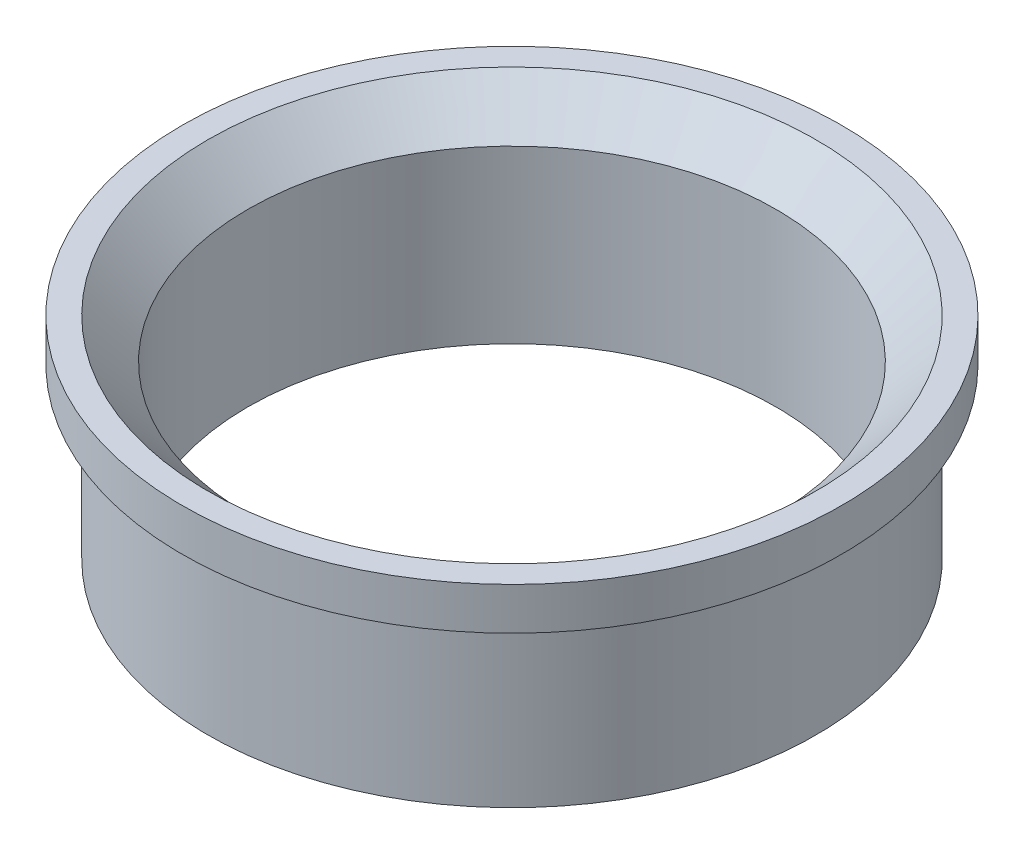
ISO-10303-21;
HEADER;
FILE_DESCRIPTION(('STEP AP214'),'2;1');
FILE_NAME('part.step','',(''),(''),'','','');
FILE_SCHEMA(('AUTOMOTIVE_DESIGN { 1 0 10303 214 1 1 1 1 }'));
ENDSEC;
DATA;
#1=APPLICATION_CONTEXT('core data for automotive mechanical design processes');
#2=APPLICATION_PROTOCOL_DEFINITION('international standard','automotive_design',2000,#1);
#3=PRODUCT_CONTEXT('',#1,'mechanical');
#4=PRODUCT('Part','Part','',(#3));
#5=PRODUCT_RELATED_PRODUCT_CATEGORY('part','',(#4));
#6=PRODUCT_DEFINITION_FORMATION('','',#4);
#7=PRODUCT_DEFINITION_CONTEXT('part definition',#1,'design');
#8=PRODUCT_DEFINITION('design','',#6,#7);
#9=PRODUCT_DEFINITION_SHAPE('','',#8);
#10=(LENGTH_UNIT() NAMED_UNIT(*) SI_UNIT(.MILLI.,.METRE.));
#11=(NAMED_UNIT(*) PLANE_ANGLE_UNIT() SI_UNIT($,.RADIAN.));
#12=(NAMED_UNIT(*) SI_UNIT($,.STERADIAN.) SOLID_ANGLE_UNIT());
#13=UNCERTAINTY_MEASURE_WITH_UNIT(LENGTH_MEASURE(1.E-05),#10,'distance_accuracy_value','');
#14=(GEOMETRIC_REPRESENTATION_CONTEXT(3) GLOBAL_UNCERTAINTY_ASSIGNED_CONTEXT((#13)) GLOBAL_UNIT_ASSIGNED_CONTEXT((#10,
#11,#12)) REPRESENTATION_CONTEXT('',''));
#15=CARTESIAN_POINT('',(0.,0.,0.));
#16=DIRECTION('',(0.,0.,1.));
#17=DIRECTION('',(1.,0.,0.));
#18=AXIS2_PLACEMENT_3D('',#15,#16,#17);
#19=CARTESIAN_POINT('',(62.5000000000041,0.,0.));
#20=DIRECTION('',(0.,1.,0.));
#21=DIRECTION('',(-1.,0.,0.));
#22=AXIS2_PLACEMENT_3D('',#19,#20,#21);
#23=PLANE('',#22);
#24=CARTESIAN_POINT('',(0.,0.,0.));
#25=DIRECTION('',(0.,1.,0.));
#26=DIRECTION('',(-1.,0.,0.));
#27=AXIS2_PLACEMENT_3D('',#24,#25,#26);
#28=CIRCLE('',#27,72.);
#29=CARTESIAN_POINT('',(-72.,0.,0.));
#30=VERTEX_POINT('',#29);
#31=EDGE_CURVE('E10',#30,#30,#28,.T.);
#32=ORIENTED_EDGE('',*,*,#31,.F.);
#33=EDGE_LOOP('',(#32));
#34=FACE_BOUND('',#33,.T.);
#35=CARTESIAN_POINT('',(0.,0.,0.));
#36=DIRECTION('',(0.,1.,0.));
#37=DIRECTION('',(-1.,0.,0.));
#38=AXIS2_PLACEMENT_3D('',#35,#36,#37);
#39=CIRCLE('',#38,62.5000000000041);
#40=CARTESIAN_POINT('',(-62.5000000000041,0.,0.));
#41=VERTEX_POINT('',#40);
#42=EDGE_CURVE('E66',#41,#41,#39,.T.);
#43=ORIENTED_EDGE('',*,*,#42,.T.);
#44=EDGE_LOOP('',(#43));
#45=FACE_BOUND('',#44,.T.);
#46=ADVANCED_FACE('F41',(#34,#45),#23,.F.);
#47=CARTESIAN_POINT('',(0.,0.,0.));
#48=DIRECTION('',(0.,1.,0.));
#49=DIRECTION('',(-1.,0.,0.));
#50=AXIS2_PLACEMENT_3D('',#47,#48,#49);
#51=CYLINDRICAL_SURFACE('',#50,72.);
#52=CARTESIAN_POINT('',(0.,40.,0.));
#53=DIRECTION('',(0.,1.,0.));
#54=DIRECTION('',(-1.,0.,0.));
#55=AXIS2_PLACEMENT_3D('',#52,#53,#54);
#56=CIRCLE('',#55,72.);
#57=CARTESIAN_POINT('',(-72.,40.,0.));
#58=VERTEX_POINT('',#57);
#59=EDGE_CURVE('E47',#58,#58,#56,.T.);
#60=ORIENTED_EDGE('',*,*,#59,.F.);
#61=EDGE_LOOP('',(#60));
#62=FACE_BOUND('',#61,.T.);
#63=ORIENTED_EDGE('',*,*,#31,.T.);
#64=EDGE_LOOP('',(#63));
#65=FACE_BOUND('',#64,.T.);
#66=ADVANCED_FACE('F97',(#62,#65),#51,.T.);
#67=CARTESIAN_POINT('',(72.,40.,0.));
#68=DIRECTION('',(0.,1.,0.));
#69=DIRECTION('',(-1.,0.,0.));
#70=AXIS2_PLACEMENT_3D('',#67,#68,#69);
#71=PLANE('',#70);
#72=CARTESIAN_POINT('',(0.,40.,0.));
#73=DIRECTION('',(0.,1.,0.));
#74=DIRECTION('',(-1.,0.,0.));
#75=AXIS2_PLACEMENT_3D('',#72,#73,#74);
#76=CIRCLE('',#75,78.);
#77=CARTESIAN_POINT('',(-78.,40.,0.));
#78=VERTEX_POINT('',#77);
#79=EDGE_CURVE('E51',#78,#78,#76,.T.);
#80=ORIENTED_EDGE('',*,*,#79,.F.);
#81=EDGE_LOOP('',(#80));
#82=FACE_BOUND('',#81,.T.);
#83=ORIENTED_EDGE('',*,*,#59,.T.);
#84=EDGE_LOOP('',(#83));
#85=FACE_BOUND('',#84,.T.);
#86=ADVANCED_FACE('F92',(#82,#85),#71,.F.);
#87=CARTESIAN_POINT('',(0.,0.,0.));
#88=DIRECTION('',(0.,1.,0.));
#89=DIRECTION('',(-1.,0.,0.));
#90=AXIS2_PLACEMENT_3D('',#87,#88,#89);
#91=CYLINDRICAL_SURFACE('',#90,78.);
#92=CARTESIAN_POINT('',(0.,50.,0.));
#93=DIRECTION('',(0.,1.,0.));
#94=DIRECTION('',(-1.,0.,0.));
#95=AXIS2_PLACEMENT_3D('',#92,#93,#94);
#96=CIRCLE('',#95,78.);
#97=CARTESIAN_POINT('',(-78.,50.,0.));
#98=VERTEX_POINT('',#97);
#99=EDGE_CURVE('E55',#98,#98,#96,.T.);
#100=ORIENTED_EDGE('',*,*,#99,.F.);
#101=EDGE_LOOP('',(#100));
#102=FACE_BOUND('',#101,.T.);
#103=ORIENTED_EDGE('',*,*,#79,.T.);
#104=EDGE_LOOP('',(#103));
#105=FACE_BOUND('',#104,.T.);
#106=ADVANCED_FACE('F86',(#102,#105),#91,.T.);
#107=CARTESIAN_POINT('',(78.,50.,0.));
#108=DIRECTION('',(0.,-1.,0.));
#109=DIRECTION('',(1.,0.,0.));
#110=AXIS2_PLACEMENT_3D('',#107,#108,#109);
#111=PLANE('',#110);
#112=CARTESIAN_POINT('',(0.,50.,0.));
#113=DIRECTION('',(0.,1.,0.));
#114=DIRECTION('',(-1.,0.,0.));
#115=AXIS2_PLACEMENT_3D('',#112,#113,#114);
#116=CIRCLE('',#115,72.);
#117=CARTESIAN_POINT('',(-72.,50.,0.));
#118=VERTEX_POINT('',#117);
#119=EDGE_CURVE('E60',#118,#118,#116,.T.);
#120=ORIENTED_EDGE('',*,*,#119,.F.);
#121=EDGE_LOOP('',(#120));
#122=FACE_BOUND('',#121,.T.);
#123=ORIENTED_EDGE('',*,*,#99,.T.);
#124=EDGE_LOOP('',(#123));
#125=FACE_BOUND('',#124,.T.);
#126=ADVANCED_FACE('F80',(#122,#125),#111,.F.);
#127=CARTESIAN_POINT('',(0.,50.,0.));
#128=DIRECTION('',(0.,1.,0.));
#129=DIRECTION('',(-1.,0.,0.));
#130=AXIS2_PLACEMENT_3D('',#127,#128,#129);
#131=CONICAL_SURFACE('',#130,72.,0.78539816339745);
#132=CARTESIAN_POINT('',(0.,40.5,0.));
#133=DIRECTION('',(0.,1.,0.));
#134=DIRECTION('',(-1.,0.,0.));
#135=AXIS2_PLACEMENT_3D('',#132,#133,#134);
#136=CIRCLE('',#135,62.5);
#137=CARTESIAN_POINT('',(-62.5,40.5,0.));
#138=VERTEX_POINT('',#137);
#139=EDGE_CURVE('E63',#138,#138,#136,.T.);
#140=ORIENTED_EDGE('',*,*,#139,.F.);
#141=EDGE_LOOP('',(#140));
#142=FACE_BOUND('',#141,.T.);
#143=ORIENTED_EDGE('',*,*,#119,.T.);
#144=EDGE_LOOP('',(#143));
#145=FACE_BOUND('',#144,.T.);
#146=ADVANCED_FACE('F74',(#142,#145),#131,.F.);
#147=CARTESIAN_POINT('',(0.,0.,0.));
#148=DIRECTION('',(0.,1.,0.));
#149=DIRECTION('',(-1.,0.,0.));
#150=AXIS2_PLACEMENT_3D('',#147,#148,#149);
#151=CYLINDRICAL_SURFACE('',#150,62.5000000000021);
#152=ORIENTED_EDGE('',*,*,#42,.F.);
#153=EDGE_LOOP('',(#152));
#154=FACE_BOUND('',#153,.T.);
#155=ORIENTED_EDGE('',*,*,#139,.T.);
#156=EDGE_LOOP('',(#155));
#157=FACE_BOUND('',#156,.T.);
#158=ADVANCED_FACE('F71',(#154,#157),#151,.F.);
#159=CLOSED_SHELL('',(#46,#66,#86,#106,#126,#146,#158));
#160=MANIFOLD_SOLID_BREP('B2',#159);
#161=ADVANCED_BREP_SHAPE_REPRESENTATION('',(#18,#160),#14);
#162=SHAPE_DEFINITION_REPRESENTATION(#9,#161);
ENDSEC;
END-ISO-10303-21;
